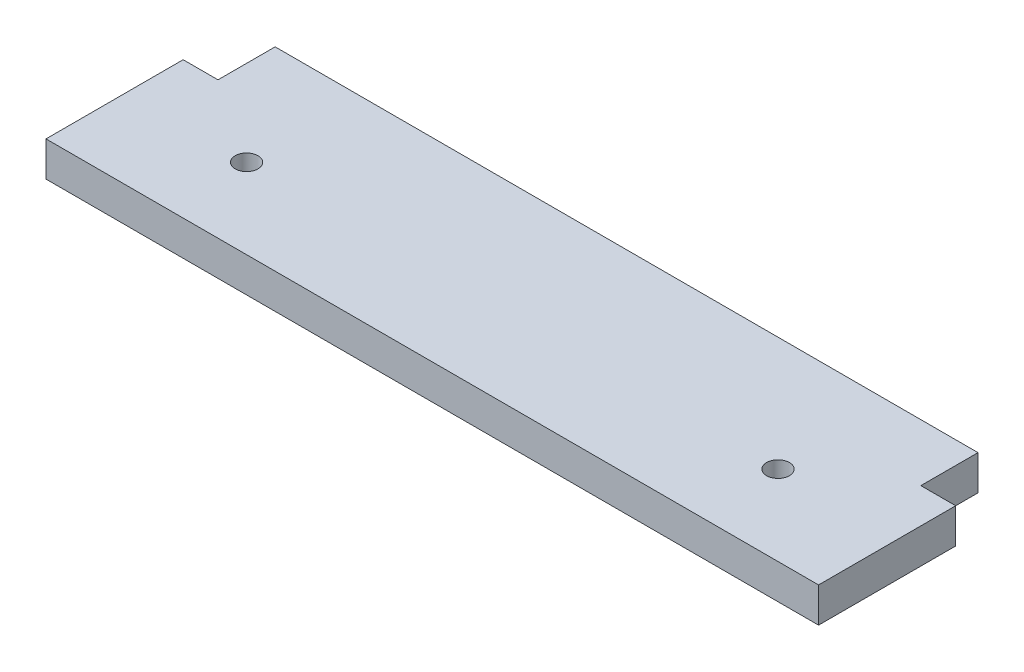
ISO-10303-21;
HEADER;
FILE_DESCRIPTION(('STEP AP214'),'2;1');
FILE_NAME('part.step','',(''),(''),'','','');
FILE_SCHEMA(('AUTOMOTIVE_DESIGN { 1 0 10303 214 1 1 1 1 }'));
ENDSEC;
DATA;
#1=APPLICATION_CONTEXT('core data for automotive mechanical design processes');
#2=APPLICATION_PROTOCOL_DEFINITION('international standard','automotive_design',2000,#1);
#3=PRODUCT_CONTEXT('',#1,'mechanical');
#4=PRODUCT('Part','Part','',(#3));
#5=PRODUCT_RELATED_PRODUCT_CATEGORY('part','',(#4));
#6=PRODUCT_DEFINITION_FORMATION('','',#4);
#7=PRODUCT_DEFINITION_CONTEXT('part definition',#1,'design');
#8=PRODUCT_DEFINITION('design','',#6,#7);
#9=PRODUCT_DEFINITION_SHAPE('','',#8);
#10=(LENGTH_UNIT() NAMED_UNIT(*) SI_UNIT(.MILLI.,.METRE.));
#11=(NAMED_UNIT(*) PLANE_ANGLE_UNIT() SI_UNIT($,.RADIAN.));
#12=(NAMED_UNIT(*) SI_UNIT($,.STERADIAN.) SOLID_ANGLE_UNIT());
#13=UNCERTAINTY_MEASURE_WITH_UNIT(LENGTH_MEASURE(1.E-05),#10,'distance_accuracy_value','');
#14=(GEOMETRIC_REPRESENTATION_CONTEXT(3) GLOBAL_UNCERTAINTY_ASSIGNED_CONTEXT((#13)) GLOBAL_UNIT_ASSIGNED_CONTEXT((#10,
#11,#12)) REPRESENTATION_CONTEXT('',''));
#15=CARTESIAN_POINT('',(0.,0.,0.));
#16=DIRECTION('',(0.,0.,1.));
#17=DIRECTION('',(1.,0.,0.));
#18=AXIS2_PLACEMENT_3D('',#15,#16,#17);
#19=CARTESIAN_POINT('',(0.,3.05,0.));
#20=DIRECTION('',(0.,0.,-1.));
#21=DIRECTION('',(-1.,0.,0.));
#22=AXIS2_PLACEMENT_3D('',#19,#20,#21);
#23=PLANE('',#22);
#24=DIRECTION('',(1.,0.,0.));
#25=VECTOR('',#24,1.);
#26=CARTESIAN_POINT('',(0.,0.,0.));
#27=LINE('',#26,#25);
#28=CARTESIAN_POINT('',(0.,0.,0.));
#29=VERTEX_POINT('',#28);
#30=CARTESIAN_POINT('',(67.6,0.,0.));
#31=VERTEX_POINT('',#30);
#32=EDGE_CURVE('E156',#29,#31,#27,.T.);
#33=ORIENTED_EDGE('',*,*,#32,.T.);
#34=DIRECTION('',(0.,-1.,0.));
#35=VECTOR('',#34,1.);
#36=CARTESIAN_POINT('',(67.6,3.05,0.));
#37=LINE('',#36,#35);
#38=CARTESIAN_POINT('',(67.6,3.05,0.));
#39=VERTEX_POINT('',#38);
#40=EDGE_CURVE('E11',#39,#31,#37,.T.);
#41=ORIENTED_EDGE('',*,*,#40,.F.);
#42=DIRECTION('',(1.,0.,0.));
#43=VECTOR('',#42,1.);
#44=CARTESIAN_POINT('',(0.,3.05,0.));
#45=LINE('',#44,#43);
#46=CARTESIAN_POINT('',(0.,3.05,0.));
#47=VERTEX_POINT('',#46);
#48=EDGE_CURVE('E219',#47,#39,#45,.T.);
#49=ORIENTED_EDGE('',*,*,#48,.F.);
#50=DIRECTION('',(0.,-1.,0.));
#51=VECTOR('',#50,1.);
#52=CARTESIAN_POINT('',(0.,3.05,0.));
#53=LINE('',#52,#51);
#54=EDGE_CURVE('E63',#47,#29,#53,.T.);
#55=ORIENTED_EDGE('',*,*,#54,.T.);
#56=EDGE_LOOP('',(#33,#41,#49,#55));
#57=FACE_BOUND('',#56,.T.);
#58=ADVANCED_FACE('F45',(#57),#23,.F.);
#59=CARTESIAN_POINT('',(67.6,3.05,0.));
#60=DIRECTION('',(-1.,0.,0.));
#61=DIRECTION('',(0.,0.,1.));
#62=AXIS2_PLACEMENT_3D('',#59,#60,#61);
#63=PLANE('',#62);
#64=DIRECTION('',(0.,0.,-1.));
#65=VECTOR('',#64,1.);
#66=CARTESIAN_POINT('',(67.6,0.,0.));
#67=LINE('',#66,#65);
#68=CARTESIAN_POINT('',(67.6,0.,-12.));
#69=VERTEX_POINT('',#68);
#70=EDGE_CURVE('E159',#31,#69,#67,.T.);
#71=ORIENTED_EDGE('',*,*,#70,.T.);
#72=DIRECTION('',(0.,-1.,0.));
#73=VECTOR('',#72,1.);
#74=CARTESIAN_POINT('',(67.6,3.05,-12.));
#75=LINE('',#74,#73);
#76=CARTESIAN_POINT('',(67.6,3.05,-12.));
#77=VERTEX_POINT('',#76);
#78=EDGE_CURVE('E55',#77,#69,#75,.T.);
#79=ORIENTED_EDGE('',*,*,#78,.F.);
#80=DIRECTION('',(0.,0.,-1.));
#81=VECTOR('',#80,1.);
#82=CARTESIAN_POINT('',(67.6,3.05,0.));
#83=LINE('',#82,#81);
#84=EDGE_CURVE('E101',#39,#77,#83,.T.);
#85=ORIENTED_EDGE('',*,*,#84,.F.);
#86=ORIENTED_EDGE('',*,*,#40,.T.);
#87=EDGE_LOOP('',(#71,#79,#85,#86));
#88=FACE_BOUND('',#87,.T.);
#89=ADVANCED_FACE('F250',(#88),#63,.F.);
#90=CARTESIAN_POINT('',(0.,3.05,-12.));
#91=DIRECTION('',(0.,0.,1.));
#92=DIRECTION('',(1.,0.,0.));
#93=AXIS2_PLACEMENT_3D('',#90,#91,#92);
#94=PLANE('',#93);
#95=DIRECTION('',(-1.,0.,0.));
#96=VECTOR('',#95,1.);
#97=CARTESIAN_POINT('',(0.,0.,-12.));
#98=LINE('',#97,#96);
#99=CARTESIAN_POINT('',(64.55,0.,-12.));
#100=VERTEX_POINT('',#99);
#101=EDGE_CURVE('E162',#69,#100,#98,.T.);
#102=ORIENTED_EDGE('',*,*,#101,.T.);
#103=DIRECTION('',(0.,-1.,0.));
#104=VECTOR('',#103,1.);
#105=CARTESIAN_POINT('',(64.55,3.05,-12.));
#106=LINE('',#105,#104);
#107=CARTESIAN_POINT('',(64.55,3.05,-12.));
#108=VERTEX_POINT('',#107);
#109=EDGE_CURVE('E193',#108,#100,#106,.T.);
#110=ORIENTED_EDGE('',*,*,#109,.F.);
#111=DIRECTION('',(-1.,0.,0.));
#112=VECTOR('',#111,1.);
#113=CARTESIAN_POINT('',(0.,3.05,-12.));
#114=LINE('',#113,#112);
#115=EDGE_CURVE('E202',#77,#108,#114,.T.);
#116=ORIENTED_EDGE('',*,*,#115,.F.);
#117=ORIENTED_EDGE('',*,*,#78,.T.);
#118=EDGE_LOOP('',(#102,#110,#116,#117));
#119=FACE_BOUND('',#118,.T.);
#120=ADVANCED_FACE('F200',(#119),#94,.F.);
#121=CARTESIAN_POINT('',(64.55,3.05,0.));
#122=DIRECTION('',(1.,0.,0.));
#123=DIRECTION('',(0.,0.,-1.));
#124=AXIS2_PLACEMENT_3D('',#121,#122,#123);
#125=PLANE('',#124);
#126=DIRECTION('',(0.,0.,1.));
#127=VECTOR('',#126,1.);
#128=CARTESIAN_POINT('',(64.55,0.,0.));
#129=LINE('',#128,#127);
#130=CARTESIAN_POINT('',(64.55,0.,-17.));
#131=VERTEX_POINT('',#130);
#132=EDGE_CURVE('E166',#131,#100,#129,.T.);
#133=ORIENTED_EDGE('',*,*,#132,.F.);
#134=DIRECTION('',(0.,-1.,0.));
#135=VECTOR('',#134,1.);
#136=CARTESIAN_POINT('',(64.55,3.05,-17.));
#137=LINE('',#136,#135);
#138=CARTESIAN_POINT('',(64.55,3.05,-17.));
#139=VERTEX_POINT('',#138);
#140=EDGE_CURVE('E190',#139,#131,#137,.T.);
#141=ORIENTED_EDGE('',*,*,#140,.F.);
#142=DIRECTION('',(0.,0.,1.));
#143=VECTOR('',#142,1.);
#144=CARTESIAN_POINT('',(64.55,3.05,0.));
#145=LINE('',#144,#143);
#146=EDGE_CURVE('E210',#139,#108,#145,.T.);
#147=ORIENTED_EDGE('',*,*,#146,.T.);
#148=ORIENTED_EDGE('',*,*,#109,.T.);
#149=EDGE_LOOP('',(#133,#141,#147,#148));
#150=FACE_BOUND('',#149,.T.);
#151=ADVANCED_FACE('F208',(#150),#125,.T.);
#152=CARTESIAN_POINT('',(0.,3.05,-17.));
#153=DIRECTION('',(0.,0.,-1.));
#154=DIRECTION('',(-1.,0.,0.));
#155=AXIS2_PLACEMENT_3D('',#152,#153,#154);
#156=PLANE('',#155);
#157=DIRECTION('',(1.,0.,0.));
#158=VECTOR('',#157,1.);
#159=CARTESIAN_POINT('',(0.,0.,-17.));
#160=LINE('',#159,#158);
#161=CARTESIAN_POINT('',(3.05,0.,-17.));
#162=VERTEX_POINT('',#161);
#163=EDGE_CURVE('E170',#162,#131,#160,.T.);
#164=ORIENTED_EDGE('',*,*,#163,.F.);
#165=DIRECTION('',(0.,-1.,0.));
#166=VECTOR('',#165,1.);
#167=CARTESIAN_POINT('',(3.05,3.05,-17.));
#168=LINE('',#167,#166);
#169=CARTESIAN_POINT('',(3.05,3.05,-17.));
#170=VERTEX_POINT('',#169);
#171=EDGE_CURVE('E138',#170,#162,#168,.T.);
#172=ORIENTED_EDGE('',*,*,#171,.F.);
#173=DIRECTION('',(1.,0.,0.));
#174=VECTOR('',#173,1.);
#175=CARTESIAN_POINT('',(0.,3.05,-17.));
#176=LINE('',#175,#174);
#177=EDGE_CURVE('E126',#170,#139,#176,.T.);
#178=ORIENTED_EDGE('',*,*,#177,.T.);
#179=ORIENTED_EDGE('',*,*,#140,.T.);
#180=EDGE_LOOP('',(#164,#172,#178,#179));
#181=FACE_BOUND('',#180,.T.);
#182=ADVANCED_FACE('F261',(#181),#156,.T.);
#183=CARTESIAN_POINT('',(3.05,3.05,0.));
#184=DIRECTION('',(1.,0.,0.));
#185=DIRECTION('',(0.,0.,-1.));
#186=AXIS2_PLACEMENT_3D('',#183,#184,#185);
#187=PLANE('',#186);
#188=DIRECTION('',(0.,0.,1.));
#189=VECTOR('',#188,1.);
#190=CARTESIAN_POINT('',(3.05,0.,0.));
#191=LINE('',#190,#189);
#192=CARTESIAN_POINT('',(3.05,0.,-12.));
#193=VERTEX_POINT('',#192);
#194=EDGE_CURVE('E134',#162,#193,#191,.T.);
#195=ORIENTED_EDGE('',*,*,#194,.T.);
#196=DIRECTION('',(0.,-1.,0.));
#197=VECTOR('',#196,1.);
#198=CARTESIAN_POINT('',(3.05,3.05,-12.));
#199=LINE('',#198,#197);
#200=CARTESIAN_POINT('',(3.05,3.05,-12.));
#201=VERTEX_POINT('',#200);
#202=EDGE_CURVE('E131',#201,#193,#199,.T.);
#203=ORIENTED_EDGE('',*,*,#202,.F.);
#204=DIRECTION('',(0.,0.,1.));
#205=VECTOR('',#204,1.);
#206=CARTESIAN_POINT('',(3.05,3.05,0.));
#207=LINE('',#206,#205);
#208=EDGE_CURVE('E118',#170,#201,#207,.T.);
#209=ORIENTED_EDGE('',*,*,#208,.F.);
#210=ORIENTED_EDGE('',*,*,#171,.T.);
#211=EDGE_LOOP('',(#195,#203,#209,#210));
#212=FACE_BOUND('',#211,.T.);
#213=ADVANCED_FACE('F132',(#212),#187,.F.);
#214=CARTESIAN_POINT('',(0.,3.05,-12.));
#215=DIRECTION('',(0.,0.,-1.));
#216=DIRECTION('',(-1.,0.,0.));
#217=AXIS2_PLACEMENT_3D('',#214,#215,#216);
#218=PLANE('',#217);
#219=DIRECTION('',(1.,0.,0.));
#220=VECTOR('',#219,1.);
#221=CARTESIAN_POINT('',(0.,0.,-12.));
#222=LINE('',#221,#220);
#223=CARTESIAN_POINT('',(0.,0.,-12.));
#224=VERTEX_POINT('',#223);
#225=EDGE_CURVE('E176',#224,#193,#222,.T.);
#226=ORIENTED_EDGE('',*,*,#225,.F.);
#227=DIRECTION('',(0.,-1.,0.));
#228=VECTOR('',#227,1.);
#229=CARTESIAN_POINT('',(0.,3.05,-12.));
#230=LINE('',#229,#228);
#231=CARTESIAN_POINT('',(0.,3.05,-12.));
#232=VERTEX_POINT('',#231);
#233=EDGE_CURVE('E89',#232,#224,#230,.T.);
#234=ORIENTED_EDGE('',*,*,#233,.F.);
#235=DIRECTION('',(1.,0.,0.));
#236=VECTOR('',#235,1.);
#237=CARTESIAN_POINT('',(0.,3.05,-12.));
#238=LINE('',#237,#236);
#239=EDGE_CURVE('E123',#232,#201,#238,.T.);
#240=ORIENTED_EDGE('',*,*,#239,.T.);
#241=ORIENTED_EDGE('',*,*,#202,.T.);
#242=EDGE_LOOP('',(#226,#234,#240,#241));
#243=FACE_BOUND('',#242,.T.);
#244=ADVANCED_FACE('F140',(#243),#218,.T.);
#245=CARTESIAN_POINT('',(10.55,3.05,-7.));
#246=DIRECTION('',(0.,-1.,0.));
#247=DIRECTION('',(0.,0.,-1.));
#248=AXIS2_PLACEMENT_3D('',#245,#246,#247);
#249=CYLINDRICAL_SURFACE('',#248,1.);
#250=CARTESIAN_POINT('',(10.55,3.05,-7.));
#251=DIRECTION('',(0.,1.,0.));
#252=DIRECTION('',(0.,0.,1.));
#253=AXIS2_PLACEMENT_3D('',#250,#251,#252);
#254=CIRCLE('',#253,1.);
#255=CARTESIAN_POINT('',(10.55,3.05,-6.));
#256=VERTEX_POINT('',#255);
#257=EDGE_CURVE('E222',#256,#256,#254,.T.);
#258=ORIENTED_EDGE('',*,*,#257,.T.);
#259=EDGE_LOOP('',(#258));
#260=FACE_BOUND('',#259,.T.);
#261=CARTESIAN_POINT('',(10.55,0.,-7.));
#262=DIRECTION('',(0.,1.,0.));
#263=DIRECTION('',(0.,0.,1.));
#264=AXIS2_PLACEMENT_3D('',#261,#262,#263);
#265=CIRCLE('',#264,1.);
#266=CARTESIAN_POINT('',(10.55,0.,-6.));
#267=VERTEX_POINT('',#266);
#268=EDGE_CURVE('E152',#267,#267,#265,.T.);
#269=ORIENTED_EDGE('',*,*,#268,.F.);
#270=EDGE_LOOP('',(#269));
#271=FACE_BOUND('',#270,.T.);
#272=ADVANCED_FACE('F238',(#260,#271),#249,.F.);
#273=CARTESIAN_POINT('',(57.05,3.05,-7.));
#274=DIRECTION('',(0.,-1.,0.));
#275=DIRECTION('',(0.,0.,-1.));
#276=AXIS2_PLACEMENT_3D('',#273,#274,#275);
#277=CYLINDRICAL_SURFACE('',#276,0.999999999999998);
#278=CARTESIAN_POINT('',(57.05,3.05,-7.));
#279=DIRECTION('',(0.,1.,0.));
#280=DIRECTION('',(0.,0.,1.));
#281=AXIS2_PLACEMENT_3D('',#278,#279,#280);
#282=CIRCLE('',#281,0.999999999999998);
#283=CARTESIAN_POINT('',(57.05,3.05,-6.));
#284=VERTEX_POINT('',#283);
#285=EDGE_CURVE('E183',#284,#284,#282,.T.);
#286=ORIENTED_EDGE('',*,*,#285,.T.);
#287=EDGE_LOOP('',(#286));
#288=FACE_BOUND('',#287,.T.);
#289=CARTESIAN_POINT('',(57.05,0.,-7.));
#290=DIRECTION('',(0.,1.,0.));
#291=DIRECTION('',(0.,0.,1.));
#292=AXIS2_PLACEMENT_3D('',#289,#290,#291);
#293=CIRCLE('',#292,0.999999999999998);
#294=CARTESIAN_POINT('',(57.05,0.,-6.));
#295=VERTEX_POINT('',#294);
#296=EDGE_CURVE('E148',#295,#295,#293,.T.);
#297=ORIENTED_EDGE('',*,*,#296,.F.);
#298=EDGE_LOOP('',(#297));
#299=FACE_BOUND('',#298,.T.);
#300=ADVANCED_FACE('F47',(#288,#299),#277,.F.);
#301=CARTESIAN_POINT('',(0.,3.05,0.));
#302=DIRECTION('',(-1.,0.,0.));
#303=DIRECTION('',(0.,0.,1.));
#304=AXIS2_PLACEMENT_3D('',#301,#302,#303);
#305=PLANE('',#304);
#306=DIRECTION('',(0.,0.,-1.));
#307=VECTOR('',#306,1.);
#308=CARTESIAN_POINT('',(0.,0.,0.));
#309=LINE('',#308,#307);
#310=EDGE_CURVE('E179',#29,#224,#309,.T.);
#311=ORIENTED_EDGE('',*,*,#310,.F.);
#312=ORIENTED_EDGE('',*,*,#54,.F.);
#313=DIRECTION('',(0.,0.,-1.));
#314=VECTOR('',#313,1.);
#315=CARTESIAN_POINT('',(0.,3.05,0.));
#316=LINE('',#315,#314);
#317=EDGE_CURVE('E142',#47,#232,#316,.T.);
#318=ORIENTED_EDGE('',*,*,#317,.T.);
#319=ORIENTED_EDGE('',*,*,#233,.T.);
#320=EDGE_LOOP('',(#311,#312,#318,#319));
#321=FACE_BOUND('',#320,.T.);
#322=ADVANCED_FACE('F234',(#321),#305,.T.);
#323=CARTESIAN_POINT('',(0.,3.05,0.));
#324=DIRECTION('',(0.,1.,0.));
#325=DIRECTION('',(0.,0.,1.));
#326=AXIS2_PLACEMENT_3D('',#323,#324,#325);
#327=PLANE('',#326);
#328=ORIENTED_EDGE('',*,*,#285,.F.);
#329=EDGE_LOOP('',(#328));
#330=FACE_BOUND('',#329,.T.);
#331=ORIENTED_EDGE('',*,*,#257,.F.);
#332=EDGE_LOOP('',(#331));
#333=FACE_BOUND('',#332,.T.);
#334=ORIENTED_EDGE('',*,*,#48,.T.);
#335=ORIENTED_EDGE('',*,*,#84,.T.);
#336=ORIENTED_EDGE('',*,*,#115,.T.);
#337=ORIENTED_EDGE('',*,*,#146,.F.);
#338=ORIENTED_EDGE('',*,*,#177,.F.);
#339=ORIENTED_EDGE('',*,*,#208,.T.);
#340=ORIENTED_EDGE('',*,*,#239,.F.);
#341=ORIENTED_EDGE('',*,*,#317,.F.);
#342=EDGE_LOOP('',(#334,#335,#336,#337,#338,#339,#340,#341));
#343=FACE_BOUND('',#342,.T.);
#344=ADVANCED_FACE('F120',(#330,#333,#343),#327,.T.);
#345=CARTESIAN_POINT('',(0.,0.,0.));
#346=DIRECTION('',(0.,1.,0.));
#347=DIRECTION('',(0.,0.,1.));
#348=AXIS2_PLACEMENT_3D('',#345,#346,#347);
#349=PLANE('',#348);
#350=ORIENTED_EDGE('',*,*,#296,.T.);
#351=EDGE_LOOP('',(#350));
#352=FACE_BOUND('',#351,.T.);
#353=ORIENTED_EDGE('',*,*,#268,.T.);
#354=EDGE_LOOP('',(#353));
#355=FACE_BOUND('',#354,.T.);
#356=ORIENTED_EDGE('',*,*,#32,.F.);
#357=ORIENTED_EDGE('',*,*,#310,.T.);
#358=ORIENTED_EDGE('',*,*,#225,.T.);
#359=ORIENTED_EDGE('',*,*,#194,.F.);
#360=ORIENTED_EDGE('',*,*,#163,.T.);
#361=ORIENTED_EDGE('',*,*,#132,.T.);
#362=ORIENTED_EDGE('',*,*,#101,.F.);
#363=ORIENTED_EDGE('',*,*,#70,.F.);
#364=EDGE_LOOP('',(#356,#357,#358,#359,#360,#361,#362,#363));
#365=FACE_BOUND('',#364,.T.);
#366=ADVANCED_FACE('F204',(#352,#355,#365),#349,.F.);
#367=CLOSED_SHELL('',(#58,#89,#120,#151,#182,#213,#244,#272,#300,#322,#344,#366));
#368=MANIFOLD_SOLID_BREP('B2',#367);
#369=ADVANCED_BREP_SHAPE_REPRESENTATION('',(#18,#368),#14);
#370=SHAPE_DEFINITION_REPRESENTATION(#9,#369);
ENDSEC;
END-ISO-10303-21;
